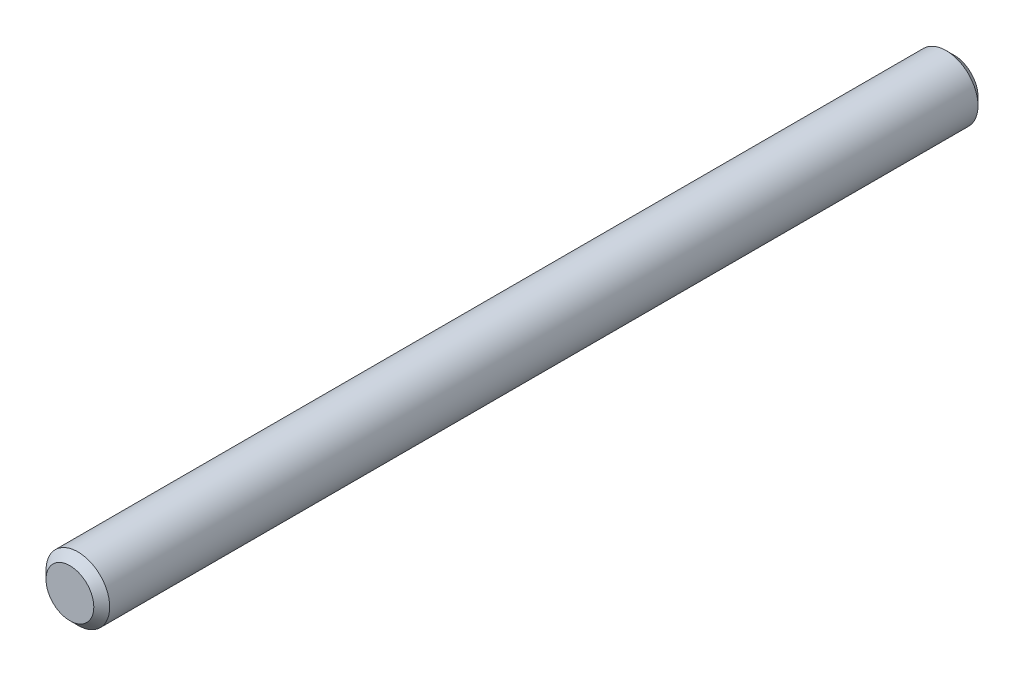
ISO-10303-21;
HEADER;
FILE_DESCRIPTION(('STEP AP214'),'2;1');
FILE_NAME('part.step','',(''),(''),'','','');
FILE_SCHEMA(('AUTOMOTIVE_DESIGN { 1 0 10303 214 1 1 1 1 }'));
ENDSEC;
DATA;
#1=APPLICATION_CONTEXT('core data for automotive mechanical design processes');
#2=APPLICATION_PROTOCOL_DEFINITION('international standard','automotive_design',2000,#1);
#3=PRODUCT_CONTEXT('',#1,'mechanical');
#4=PRODUCT('Part','Part','',(#3));
#5=PRODUCT_RELATED_PRODUCT_CATEGORY('part','',(#4));
#6=PRODUCT_DEFINITION_FORMATION('','',#4);
#7=PRODUCT_DEFINITION_CONTEXT('part definition',#1,'design');
#8=PRODUCT_DEFINITION('design','',#6,#7);
#9=PRODUCT_DEFINITION_SHAPE('','',#8);
#10=(LENGTH_UNIT() NAMED_UNIT(*) SI_UNIT(.MILLI.,.METRE.));
#11=(NAMED_UNIT(*) PLANE_ANGLE_UNIT() SI_UNIT($,.RADIAN.));
#12=(NAMED_UNIT(*) SI_UNIT($,.STERADIAN.) SOLID_ANGLE_UNIT());
#13=UNCERTAINTY_MEASURE_WITH_UNIT(LENGTH_MEASURE(1.E-05),#10,'distance_accuracy_value','');
#14=(GEOMETRIC_REPRESENTATION_CONTEXT(3) GLOBAL_UNCERTAINTY_ASSIGNED_CONTEXT((#13)) GLOBAL_UNIT_ASSIGNED_CONTEXT((#10,
#11,#12)) REPRESENTATION_CONTEXT('',''));
#15=CARTESIAN_POINT('',(0.,0.,0.));
#16=DIRECTION('',(0.,0.,1.));
#17=DIRECTION('',(1.,0.,0.));
#18=AXIS2_PLACEMENT_3D('',#15,#16,#17);
#19=CARTESIAN_POINT('',(0.,0.,111.));
#20=DIRECTION('',(0.,0.,-1.));
#21=DIRECTION('',(-1.,0.,0.));
#22=AXIS2_PLACEMENT_3D('',#19,#20,#21);
#23=CYLINDRICAL_SURFACE('',#22,4.);
#24=CARTESIAN_POINT('',(0.,0.,1.));
#25=DIRECTION('',(0.,0.,1.));
#26=DIRECTION('',(1.,0.,0.));
#27=AXIS2_PLACEMENT_3D('',#24,#25,#26);
#28=CIRCLE('',#27,4.);
#29=CARTESIAN_POINT('',(4.,0.,1.));
#30=VERTEX_POINT('',#29);
#31=EDGE_CURVE('E53',#30,#30,#28,.T.);
#32=ORIENTED_EDGE('',*,*,#31,.T.);
#33=EDGE_LOOP('',(#32));
#34=FACE_BOUND('',#33,.T.);
#35=CARTESIAN_POINT('',(0.,0.,110.));
#36=DIRECTION('',(0.,0.,1.));
#37=DIRECTION('',(1.,0.,0.));
#38=AXIS2_PLACEMENT_3D('',#35,#36,#37);
#39=CIRCLE('',#38,4.);
#40=CARTESIAN_POINT('',(4.,0.,110.));
#41=VERTEX_POINT('',#40);
#42=EDGE_CURVE('E58',#41,#41,#39,.F.);
#43=ORIENTED_EDGE('',*,*,#42,.T.);
#44=EDGE_LOOP('',(#43));
#45=FACE_BOUND('',#44,.T.);
#46=ADVANCED_FACE('F39',(#34,#45),#23,.T.);
#47=CARTESIAN_POINT('',(0.,0.,111.));
#48=DIRECTION('',(0.,0.,1.));
#49=DIRECTION('',(1.,0.,0.));
#50=AXIS2_PLACEMENT_3D('',#47,#48,#49);
#51=PLANE('',#50);
#52=CARTESIAN_POINT('',(0.,0.,111.));
#53=DIRECTION('',(0.,0.,1.));
#54=DIRECTION('',(1.,0.,0.));
#55=AXIS2_PLACEMENT_3D('',#52,#53,#54);
#56=CIRCLE('',#55,2.99999999999998);
#57=CARTESIAN_POINT('',(2.99999999999998,0.,111.));
#58=VERTEX_POINT('',#57);
#59=EDGE_CURVE('E10',#58,#58,#56,.T.);
#60=ORIENTED_EDGE('',*,*,#59,.T.);
#61=EDGE_LOOP('',(#60));
#62=FACE_BOUND('',#61,.T.);
#63=ADVANCED_FACE('F75',(#62),#51,.T.);
#64=CARTESIAN_POINT('',(0.,0.,0.));
#65=DIRECTION('',(0.,0.,1.));
#66=DIRECTION('',(1.,0.,0.));
#67=AXIS2_PLACEMENT_3D('',#64,#65,#66);
#68=PLANE('',#67);
#69=CARTESIAN_POINT('',(0.,0.,0.));
#70=DIRECTION('',(0.,0.,1.));
#71=DIRECTION('',(1.,0.,0.));
#72=AXIS2_PLACEMENT_3D('',#69,#70,#71);
#73=CIRCLE('',#72,3.);
#74=CARTESIAN_POINT('',(3.,0.,0.));
#75=VERTEX_POINT('',#74);
#76=EDGE_CURVE('E48',#75,#75,#73,.F.);
#77=ORIENTED_EDGE('',*,*,#76,.T.);
#78=EDGE_LOOP('',(#77));
#79=FACE_BOUND('',#78,.T.);
#80=ADVANCED_FACE('F72',(#79),#68,.F.);
#81=CARTESIAN_POINT('',(0.,0.,1.));
#82=DIRECTION('',(0.,0.,1.));
#83=DIRECTION('',(1.,0.,0.));
#84=AXIS2_PLACEMENT_3D('',#81,#82,#83);
#85=CONICAL_SURFACE('',#84,4.,0.785398163397447);
#86=ORIENTED_EDGE('',*,*,#76,.F.);
#87=EDGE_LOOP('',(#86));
#88=FACE_BOUND('',#87,.T.);
#89=ORIENTED_EDGE('',*,*,#31,.F.);
#90=EDGE_LOOP('',(#89));
#91=FACE_BOUND('',#90,.T.);
#92=ADVANCED_FACE('F68',(#88,#91),#85,.T.);
#93=CARTESIAN_POINT('',(0.,0.,111.));
#94=DIRECTION('',(0.,0.,-1.));
#95=DIRECTION('',(-1.,0.,0.));
#96=AXIS2_PLACEMENT_3D('',#93,#94,#95);
#97=CONICAL_SURFACE('',#96,2.99999999999998,0.785398163397447);
#98=ORIENTED_EDGE('',*,*,#42,.F.);
#99=EDGE_LOOP('',(#98));
#100=FACE_BOUND('',#99,.T.);
#101=ORIENTED_EDGE('',*,*,#59,.F.);
#102=EDGE_LOOP('',(#101));
#103=FACE_BOUND('',#102,.T.);
#104=ADVANCED_FACE('F42',(#100,#103),#97,.T.);
#105=CLOSED_SHELL('',(#46,#63,#80,#92,#104));
#106=MANIFOLD_SOLID_BREP('B2',#105);
#107=ADVANCED_BREP_SHAPE_REPRESENTATION('',(#18,#106),#14);
#108=SHAPE_DEFINITION_REPRESENTATION(#9,#107);
ENDSEC;
END-ISO-10303-21;
